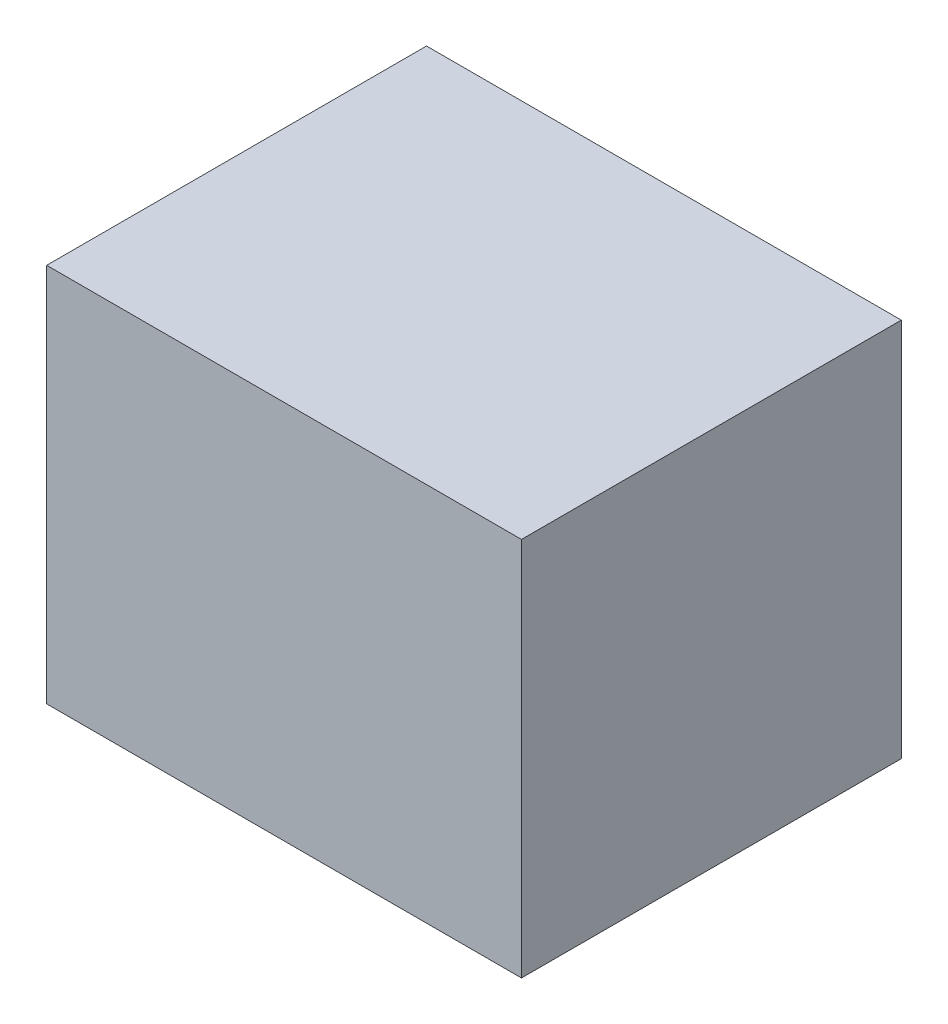
ISO-10303-21;
HEADER;
FILE_DESCRIPTION(('STEP AP214'),'2;1');
FILE_NAME('part.step','',(''),(''),'','','');
FILE_SCHEMA(('AUTOMOTIVE_DESIGN { 1 0 10303 214 1 1 1 1 }'));
ENDSEC;
DATA;
#1=APPLICATION_CONTEXT('core data for automotive mechanical design processes');
#2=APPLICATION_PROTOCOL_DEFINITION('international standard','automotive_design',2000,#1);
#3=PRODUCT_CONTEXT('',#1,'mechanical');
#4=PRODUCT('Part','Part','',(#3));
#5=PRODUCT_RELATED_PRODUCT_CATEGORY('part','',(#4));
#6=PRODUCT_DEFINITION_FORMATION('','',#4);
#7=PRODUCT_DEFINITION_CONTEXT('part definition',#1,'design');
#8=PRODUCT_DEFINITION('design','',#6,#7);
#9=PRODUCT_DEFINITION_SHAPE('','',#8);
#10=(LENGTH_UNIT() NAMED_UNIT(*) SI_UNIT(.MILLI.,.METRE.));
#11=(NAMED_UNIT(*) PLANE_ANGLE_UNIT() SI_UNIT($,.RADIAN.));
#12=(NAMED_UNIT(*) SI_UNIT($,.STERADIAN.) SOLID_ANGLE_UNIT());
#13=UNCERTAINTY_MEASURE_WITH_UNIT(LENGTH_MEASURE(1.E-05),#10,'distance_accuracy_value','');
#14=(GEOMETRIC_REPRESENTATION_CONTEXT(3) GLOBAL_UNCERTAINTY_ASSIGNED_CONTEXT((#13)) GLOBAL_UNIT_ASSIGNED_CONTEXT((#10,
#11,#12)) REPRESENTATION_CONTEXT('',''));
#15=CARTESIAN_POINT('',(0.,0.,0.));
#16=DIRECTION('',(0.,0.,1.));
#17=DIRECTION('',(1.,0.,0.));
#18=AXIS2_PLACEMENT_3D('',#15,#16,#17);
#19=CARTESIAN_POINT('',(127.,50.8,50.8));
#20=DIRECTION('',(0.,1.,0.));
#21=DIRECTION('',(0.,0.,1.));
#22=AXIS2_PLACEMENT_3D('',#19,#20,#21);
#23=PLANE('',#22);
#24=DIRECTION('',(0.,0.,-1.));
#25=VECTOR('',#24,1.);
#26=CARTESIAN_POINT('',(0.,50.8,50.8));
#27=LINE('',#26,#25);
#28=CARTESIAN_POINT('',(0.,50.8,50.8));
#29=VERTEX_POINT('',#28);
#30=CARTESIAN_POINT('',(0.,50.8,-50.8));
#31=VERTEX_POINT('',#30);
#32=EDGE_CURVE('E110',#29,#31,#27,.T.);
#33=ORIENTED_EDGE('',*,*,#32,.F.);
#34=DIRECTION('',(-1.,0.,0.));
#35=VECTOR('',#34,1.);
#36=CARTESIAN_POINT('',(127.,50.8,50.8));
#37=LINE('',#36,#35);
#38=CARTESIAN_POINT('',(127.,50.8,50.8));
#39=VERTEX_POINT('',#38);
#40=EDGE_CURVE('E11',#39,#29,#37,.T.);
#41=ORIENTED_EDGE('',*,*,#40,.F.);
#42=DIRECTION('',(0.,0.,-1.));
#43=VECTOR('',#42,1.);
#44=CARTESIAN_POINT('',(127.,50.8,50.8));
#45=LINE('',#44,#43);
#46=CARTESIAN_POINT('',(127.,50.8,-50.8));
#47=VERTEX_POINT('',#46);
#48=EDGE_CURVE('E103',#39,#47,#45,.T.);
#49=ORIENTED_EDGE('',*,*,#48,.T.);
#50=DIRECTION('',(-1.,0.,0.));
#51=VECTOR('',#50,1.);
#52=CARTESIAN_POINT('',(127.,50.8,-50.8));
#53=LINE('',#52,#51);
#54=EDGE_CURVE('E42',#47,#31,#53,.T.);
#55=ORIENTED_EDGE('',*,*,#54,.T.);
#56=EDGE_LOOP('',(#33,#41,#49,#55));
#57=FACE_BOUND('',#56,.T.);
#58=ADVANCED_FACE('F39',(#57),#23,.T.);
#59=CARTESIAN_POINT('',(127.,50.8,50.8));
#60=DIRECTION('',(0.,0.,-1.));
#61=DIRECTION('',(0.,1.,0.));
#62=AXIS2_PLACEMENT_3D('',#59,#60,#61);
#63=PLANE('',#62);
#64=DIRECTION('',(0.,-1.,0.));
#65=VECTOR('',#64,1.);
#66=CARTESIAN_POINT('',(0.,50.8,50.8));
#67=LINE('',#66,#65);
#68=CARTESIAN_POINT('',(0.,-50.8,50.8));
#69=VERTEX_POINT('',#68);
#70=EDGE_CURVE('E73',#29,#69,#67,.T.);
#71=ORIENTED_EDGE('',*,*,#70,.T.);
#72=DIRECTION('',(-1.,0.,0.));
#73=VECTOR('',#72,1.);
#74=CARTESIAN_POINT('',(127.,-50.8,50.8));
#75=LINE('',#74,#73);
#76=CARTESIAN_POINT('',(127.,-50.8,50.8));
#77=VERTEX_POINT('',#76);
#78=EDGE_CURVE('E49',#77,#69,#75,.T.);
#79=ORIENTED_EDGE('',*,*,#78,.F.);
#80=DIRECTION('',(0.,-1.,0.));
#81=VECTOR('',#80,1.);
#82=CARTESIAN_POINT('',(127.,50.8,50.8));
#83=LINE('',#82,#81);
#84=EDGE_CURVE('E90',#39,#77,#83,.T.);
#85=ORIENTED_EDGE('',*,*,#84,.F.);
#86=ORIENTED_EDGE('',*,*,#40,.T.);
#87=EDGE_LOOP('',(#71,#79,#85,#86));
#88=FACE_BOUND('',#87,.T.);
#89=ADVANCED_FACE('F126',(#88),#63,.F.);
#90=CARTESIAN_POINT('',(127.,-50.8,50.8));
#91=DIRECTION('',(0.,1.,0.));
#92=DIRECTION('',(0.,0.,1.));
#93=AXIS2_PLACEMENT_3D('',#90,#91,#92);
#94=PLANE('',#93);
#95=DIRECTION('',(0.,0.,-1.));
#96=VECTOR('',#95,1.);
#97=CARTESIAN_POINT('',(0.,-50.8,50.8));
#98=LINE('',#97,#96);
#99=CARTESIAN_POINT('',(0.,-50.8,-50.8));
#100=VERTEX_POINT('',#99);
#101=EDGE_CURVE('E98',#69,#100,#98,.T.);
#102=ORIENTED_EDGE('',*,*,#101,.T.);
#103=DIRECTION('',(-1.,0.,0.));
#104=VECTOR('',#103,1.);
#105=CARTESIAN_POINT('',(127.,-50.8,-50.8));
#106=LINE('',#105,#104);
#107=CARTESIAN_POINT('',(127.,-50.8,-50.8));
#108=VERTEX_POINT('',#107);
#109=EDGE_CURVE('E95',#108,#100,#106,.T.);
#110=ORIENTED_EDGE('',*,*,#109,.F.);
#111=DIRECTION('',(0.,0.,-1.));
#112=VECTOR('',#111,1.);
#113=CARTESIAN_POINT('',(127.,-50.8,50.8));
#114=LINE('',#113,#112);
#115=EDGE_CURVE('E85',#77,#108,#114,.T.);
#116=ORIENTED_EDGE('',*,*,#115,.F.);
#117=ORIENTED_EDGE('',*,*,#78,.T.);
#118=EDGE_LOOP('',(#102,#110,#116,#117));
#119=FACE_BOUND('',#118,.T.);
#120=ADVANCED_FACE('F96',(#119),#94,.F.);
#121=CARTESIAN_POINT('',(127.,50.8,-50.8));
#122=DIRECTION('',(0.,0.,-1.));
#123=DIRECTION('',(0.,1.,0.));
#124=AXIS2_PLACEMENT_3D('',#121,#122,#123);
#125=PLANE('',#124);
#126=DIRECTION('',(0.,-1.,0.));
#127=VECTOR('',#126,1.);
#128=CARTESIAN_POINT('',(0.,50.8,-50.8));
#129=LINE('',#128,#127);
#130=EDGE_CURVE('E114',#31,#100,#129,.T.);
#131=ORIENTED_EDGE('',*,*,#130,.F.);
#132=ORIENTED_EDGE('',*,*,#54,.F.);
#133=DIRECTION('',(0.,-1.,0.));
#134=VECTOR('',#133,1.);
#135=CARTESIAN_POINT('',(127.,50.8,-50.8));
#136=LINE('',#135,#134);
#137=EDGE_CURVE('E89',#47,#108,#136,.T.);
#138=ORIENTED_EDGE('',*,*,#137,.T.);
#139=ORIENTED_EDGE('',*,*,#109,.T.);
#140=EDGE_LOOP('',(#131,#132,#138,#139));
#141=FACE_BOUND('',#140,.T.);
#142=ADVANCED_FACE('F101',(#141),#125,.T.);
#143=CARTESIAN_POINT('',(127.,0.,0.));
#144=DIRECTION('',(-1.,0.,0.));
#145=DIRECTION('',(0.,0.,1.));
#146=AXIS2_PLACEMENT_3D('',#143,#144,#145);
#147=PLANE('',#146);
#148=ORIENTED_EDGE('',*,*,#48,.F.);
#149=ORIENTED_EDGE('',*,*,#84,.T.);
#150=ORIENTED_EDGE('',*,*,#115,.T.);
#151=ORIENTED_EDGE('',*,*,#137,.F.);
#152=EDGE_LOOP('',(#148,#149,#150,#151));
#153=FACE_BOUND('',#152,.T.);
#154=ADVANCED_FACE('F88',(#153),#147,.F.);
#155=CARTESIAN_POINT('',(0.,0.,0.));
#156=DIRECTION('',(-1.,0.,0.));
#157=DIRECTION('',(0.,0.,1.));
#158=AXIS2_PLACEMENT_3D('',#155,#156,#157);
#159=PLANE('',#158);
#160=ORIENTED_EDGE('',*,*,#32,.T.);
#161=ORIENTED_EDGE('',*,*,#130,.T.);
#162=ORIENTED_EDGE('',*,*,#101,.F.);
#163=ORIENTED_EDGE('',*,*,#70,.F.);
#164=EDGE_LOOP('',(#160,#161,#162,#163));
#165=FACE_BOUND('',#164,.T.);
#166=ADVANCED_FACE('F123',(#165),#159,.T.);
#167=CLOSED_SHELL('',(#58,#89,#120,#142,#154,#166));
#168=MANIFOLD_SOLID_BREP('B2',#167);
#169=ADVANCED_BREP_SHAPE_REPRESENTATION('',(#18,#168),#14);
#170=SHAPE_DEFINITION_REPRESENTATION(#9,#169);
ENDSEC;
END-ISO-10303-21;
